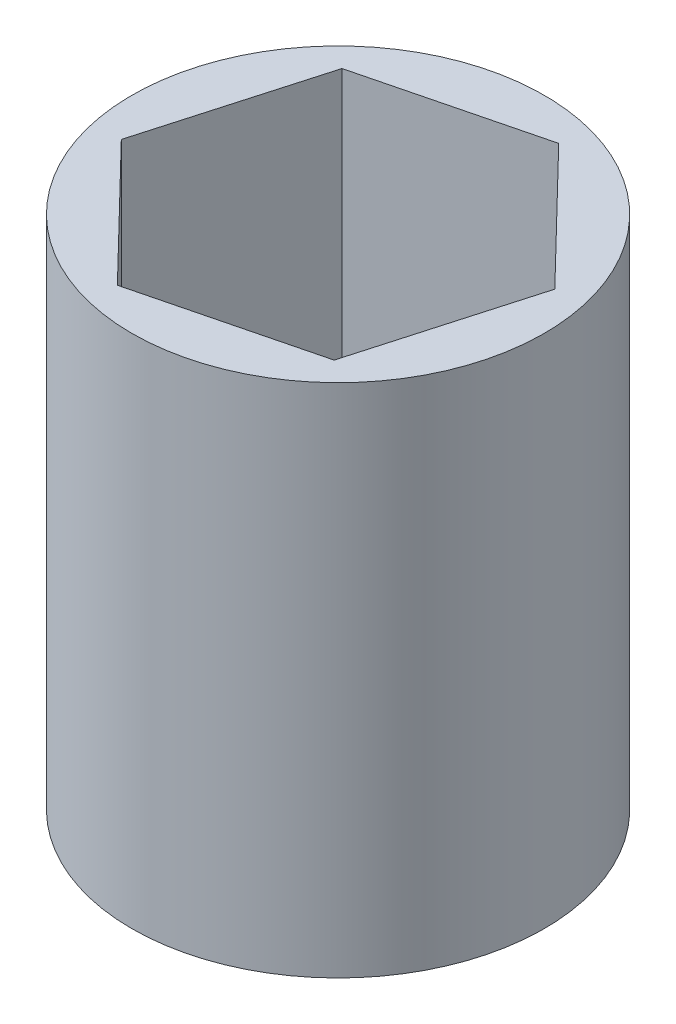
ISO-10303-21;
HEADER;
FILE_DESCRIPTION(('STEP AP214'),'2;1');
FILE_NAME('part.step','',(''),(''),'','','');
FILE_SCHEMA(('AUTOMOTIVE_DESIGN { 1 0 10303 214 1 1 1 1 }'));
ENDSEC;
DATA;
#1=APPLICATION_CONTEXT('core data for automotive mechanical design processes');
#2=APPLICATION_PROTOCOL_DEFINITION('international standard','automotive_design',2000,#1);
#3=PRODUCT_CONTEXT('',#1,'mechanical');
#4=PRODUCT('Part','Part','',(#3));
#5=PRODUCT_RELATED_PRODUCT_CATEGORY('part','',(#4));
#6=PRODUCT_DEFINITION_FORMATION('','',#4);
#7=PRODUCT_DEFINITION_CONTEXT('part definition',#1,'design');
#8=PRODUCT_DEFINITION('design','',#6,#7);
#9=PRODUCT_DEFINITION_SHAPE('','',#8);
#10=(LENGTH_UNIT() NAMED_UNIT(*) SI_UNIT(.MILLI.,.METRE.));
#11=(NAMED_UNIT(*) PLANE_ANGLE_UNIT() SI_UNIT($,.RADIAN.));
#12=(NAMED_UNIT(*) SI_UNIT($,.STERADIAN.) SOLID_ANGLE_UNIT());
#13=UNCERTAINTY_MEASURE_WITH_UNIT(LENGTH_MEASURE(1.E-05),#10,'distance_accuracy_value','');
#14=(GEOMETRIC_REPRESENTATION_CONTEXT(3) GLOBAL_UNCERTAINTY_ASSIGNED_CONTEXT((#13)) GLOBAL_UNIT_ASSIGNED_CONTEXT((#10,
#11,#12)) REPRESENTATION_CONTEXT('',''));
#15=CARTESIAN_POINT('',(0.,0.,0.));
#16=DIRECTION('',(0.,0.,1.));
#17=DIRECTION('',(1.,0.,0.));
#18=AXIS2_PLACEMENT_3D('',#15,#16,#17);
#19=CARTESIAN_POINT('',(0.,15.875,0.));
#20=DIRECTION('',(0.,1.,0.));
#21=DIRECTION('',(0.,0.,1.));
#22=AXIS2_PLACEMENT_3D('',#19,#20,#21);
#23=PLANE('',#22);
#24=CARTESIAN_POINT('',(0.,15.875,0.));
#25=DIRECTION('',(0.,1.,0.));
#26=DIRECTION('',(0.,0.,1.));
#27=AXIS2_PLACEMENT_3D('',#24,#25,#26);
#28=CIRCLE('',#27,6.35);
#29=CARTESIAN_POINT('',(0.,15.875,6.35));
#30=VERTEX_POINT('',#29);
#31=EDGE_CURVE('E11',#30,#30,#28,.T.);
#32=ORIENTED_EDGE('',*,*,#31,.T.);
#33=EDGE_LOOP('',(#32));
#34=FACE_BOUND('',#33,.T.);
#35=DIRECTION('',(-0.969830096251339,0.,0.243781837726107));
#36=VECTOR('',#35,1.);
#37=CARTESIAN_POINT('',(1.50566356257848,15.875,-5.28912584803231));
#38=LINE('',#37,#36);
#39=CARTESIAN_POINT('',(1.50566356257848,15.875,-5.28912584803231));
#40=VERTEX_POINT('',#39);
#41=CARTESIAN_POINT('',(-3.82768556691965,15.875,-3.9485058187617));
#42=VERTEX_POINT('',#41);
#43=EDGE_CURVE('E93',#40,#42,#38,.T.);
#44=ORIENTED_EDGE('',*,*,#43,.F.);
#45=DIRECTION('',(-0.696036312577735,0.,-0.718006581845313));
#46=VECTOR('',#45,1.);
#47=CARTESIAN_POINT('',(5.33334912949813,15.875,-1.34062002927061));
#48=LINE('',#47,#46);
#49=CARTESIAN_POINT('',(5.33334912949813,15.875,-1.34062002927061));
#50=VERTEX_POINT('',#49);
#51=EDGE_CURVE('E85',#50,#40,#48,.T.);
#52=ORIENTED_EDGE('',*,*,#51,.F.);
#53=DIRECTION('',(0.273793783673605,0.,-0.961788419571421));
#54=VECTOR('',#53,1.);
#55=CARTESIAN_POINT('',(3.82768556691965,15.875,3.9485058187617));
#56=LINE('',#55,#54);
#57=CARTESIAN_POINT('',(3.82768556691965,15.875,3.9485058187617));
#58=VERTEX_POINT('',#57);
#59=EDGE_CURVE('E113',#58,#50,#56,.T.);
#60=ORIENTED_EDGE('',*,*,#59,.F.);
#61=DIRECTION('',(0.969830096251339,0.,-0.243781837726108));
#62=VECTOR('',#61,1.);
#63=CARTESIAN_POINT('',(-1.50566356257847,15.875,5.28912584803231));
#64=LINE('',#63,#62);
#65=CARTESIAN_POINT('',(-1.50566356257847,15.875,5.28912584803231));
#66=VERTEX_POINT('',#65);
#67=EDGE_CURVE('E111',#66,#58,#64,.T.);
#68=ORIENTED_EDGE('',*,*,#67,.F.);
#69=DIRECTION('',(0.696036312577735,0.,0.718006581845313));
#70=VECTOR('',#69,1.);
#71=CARTESIAN_POINT('',(-5.33334912949813,15.875,1.34062002927061));
#72=LINE('',#71,#70);
#73=CARTESIAN_POINT('',(-5.33334912949813,15.875,1.34062002927061));
#74=VERTEX_POINT('',#73);
#75=EDGE_CURVE('E107',#74,#66,#72,.T.);
#76=ORIENTED_EDGE('',*,*,#75,.F.);
#77=DIRECTION('',(-0.273793783673604,0.,0.961788419571421));
#78=VECTOR('',#77,1.);
#79=CARTESIAN_POINT('',(-3.82768556691965,15.875,-3.9485058187617));
#80=LINE('',#79,#78);
#81=EDGE_CURVE('E105',#42,#74,#80,.T.);
#82=ORIENTED_EDGE('',*,*,#81,.F.);
#83=EDGE_LOOP('',(#44,#52,#60,#68,#76,#82));
#84=FACE_BOUND('',#83,.T.);
#85=ADVANCED_FACE('F32',(#34,#84),#23,.T.);
#86=CARTESIAN_POINT('',(0.,0.,0.));
#87=DIRECTION('',(0.,1.,0.));
#88=DIRECTION('',(0.,0.,1.));
#89=AXIS2_PLACEMENT_3D('',#86,#87,#88);
#90=PLANE('',#89);
#91=CARTESIAN_POINT('',(0.,0.,0.));
#92=DIRECTION('',(0.,1.,0.));
#93=DIRECTION('',(0.,0.,1.));
#94=AXIS2_PLACEMENT_3D('',#91,#92,#93);
#95=CIRCLE('',#94,6.35);
#96=CARTESIAN_POINT('',(0.,0.,6.35));
#97=VERTEX_POINT('',#96);
#98=EDGE_CURVE('E36',#97,#97,#95,.T.);
#99=ORIENTED_EDGE('',*,*,#98,.F.);
#100=EDGE_LOOP('',(#99));
#101=FACE_BOUND('',#100,.T.);
#102=DIRECTION('',(-0.696036312577735,0.,-0.718006581845313));
#103=VECTOR('',#102,1.);
#104=CARTESIAN_POINT('',(5.33334912949813,0.,-1.34062002927061));
#105=LINE('',#104,#103);
#106=CARTESIAN_POINT('',(5.33334912949813,0.,-1.34062002927061));
#107=VERTEX_POINT('',#106);
#108=CARTESIAN_POINT('',(1.50566356257848,0.,-5.28912584803231));
#109=VERTEX_POINT('',#108);
#110=EDGE_CURVE('E55',#107,#109,#105,.T.);
#111=ORIENTED_EDGE('',*,*,#110,.T.);
#112=DIRECTION('',(-0.969830096251339,0.,0.243781837726107));
#113=VECTOR('',#112,1.);
#114=CARTESIAN_POINT('',(1.50566356257848,0.,-5.28912584803231));
#115=LINE('',#114,#113);
#116=CARTESIAN_POINT('',(-3.82768556691965,0.,-3.9485058187617));
#117=VERTEX_POINT('',#116);
#118=EDGE_CURVE('E100',#109,#117,#115,.T.);
#119=ORIENTED_EDGE('',*,*,#118,.T.);
#120=DIRECTION('',(-0.273793783673604,0.,0.961788419571421));
#121=VECTOR('',#120,1.);
#122=CARTESIAN_POINT('',(-3.82768556691965,0.,-3.9485058187617));
#123=LINE('',#122,#121);
#124=CARTESIAN_POINT('',(-5.33334912949813,0.,1.34062002927061));
#125=VERTEX_POINT('',#124);
#126=EDGE_CURVE('E117',#117,#125,#123,.T.);
#127=ORIENTED_EDGE('',*,*,#126,.T.);
#128=DIRECTION('',(0.696036312577735,0.,0.718006581845313));
#129=VECTOR('',#128,1.);
#130=CARTESIAN_POINT('',(-5.33334912949813,0.,1.34062002927061));
#131=LINE('',#130,#129);
#132=CARTESIAN_POINT('',(-1.50566356257847,0.,5.28912584803231));
#133=VERTEX_POINT('',#132);
#134=EDGE_CURVE('E120',#125,#133,#131,.T.);
#135=ORIENTED_EDGE('',*,*,#134,.T.);
#136=DIRECTION('',(0.969830096251339,0.,-0.243781837726108));
#137=VECTOR('',#136,1.);
#138=CARTESIAN_POINT('',(-1.50566356257847,0.,5.28912584803231));
#139=LINE('',#138,#137);
#140=CARTESIAN_POINT('',(3.82768556691965,0.,3.9485058187617));
#141=VERTEX_POINT('',#140);
#142=EDGE_CURVE('E123',#133,#141,#139,.T.);
#143=ORIENTED_EDGE('',*,*,#142,.T.);
#144=DIRECTION('',(0.273793783673605,0.,-0.961788419571421));
#145=VECTOR('',#144,1.);
#146=CARTESIAN_POINT('',(3.82768556691965,0.,3.9485058187617));
#147=LINE('',#146,#145);
#148=EDGE_CURVE('E94',#141,#107,#147,.T.);
#149=ORIENTED_EDGE('',*,*,#148,.T.);
#150=EDGE_LOOP('',(#111,#119,#127,#135,#143,#149));
#151=FACE_BOUND('',#150,.T.);
#152=ADVANCED_FACE('F140',(#101,#151),#90,.F.);
#153=CARTESIAN_POINT('',(0.,15.875,0.));
#154=DIRECTION('',(0.,-1.,0.));
#155=DIRECTION('',(0.,0.,-1.));
#156=AXIS2_PLACEMENT_3D('',#153,#154,#155);
#157=CYLINDRICAL_SURFACE('',#156,6.35);
#158=ORIENTED_EDGE('',*,*,#31,.F.);
#159=EDGE_LOOP('',(#158));
#160=FACE_BOUND('',#159,.T.);
#161=ORIENTED_EDGE('',*,*,#98,.T.);
#162=EDGE_LOOP('',(#161));
#163=FACE_BOUND('',#162,.T.);
#164=ADVANCED_FACE('F34',(#160,#163),#157,.T.);
#165=CARTESIAN_POINT('',(5.33334912949813,15.875,-1.34062002927061));
#166=DIRECTION('',(-0.718006581845313,0.,0.696036312577735));
#167=DIRECTION('',(0.696036312577735,0.,0.718006581845313));
#168=AXIS2_PLACEMENT_3D('',#165,#166,#167);
#169=PLANE('',#168);
#170=ORIENTED_EDGE('',*,*,#110,.F.);
#171=DIRECTION('',(0.,-1.,0.));
#172=VECTOR('',#171,1.);
#173=CARTESIAN_POINT('',(5.33334912949813,15.875,-1.34062002927061));
#174=LINE('',#173,#172);
#175=EDGE_CURVE('E89',#50,#107,#174,.T.);
#176=ORIENTED_EDGE('',*,*,#175,.F.);
#177=ORIENTED_EDGE('',*,*,#51,.T.);
#178=DIRECTION('',(0.,-1.,0.));
#179=VECTOR('',#178,1.);
#180=CARTESIAN_POINT('',(1.50566356257848,15.875,-5.28912584803231));
#181=LINE('',#180,#179);
#182=EDGE_CURVE('E88',#40,#109,#181,.T.);
#183=ORIENTED_EDGE('',*,*,#182,.T.);
#184=EDGE_LOOP('',(#170,#176,#177,#183));
#185=FACE_BOUND('',#184,.T.);
#186=ADVANCED_FACE('F87',(#185),#169,.T.);
#187=CARTESIAN_POINT('',(1.50566356257848,15.875,-5.28912584803231));
#188=DIRECTION('',(0.243781837726107,0.,0.969830096251339));
#189=DIRECTION('',(0.969830096251339,0.,-0.243781837726107));
#190=AXIS2_PLACEMENT_3D('',#187,#188,#189);
#191=PLANE('',#190);
#192=ORIENTED_EDGE('',*,*,#118,.F.);
#193=ORIENTED_EDGE('',*,*,#182,.F.);
#194=ORIENTED_EDGE('',*,*,#43,.T.);
#195=DIRECTION('',(0.,-1.,0.));
#196=VECTOR('',#195,1.);
#197=CARTESIAN_POINT('',(-3.82768556691965,15.875,-3.9485058187617));
#198=LINE('',#197,#196);
#199=EDGE_CURVE('E101',#42,#117,#198,.T.);
#200=ORIENTED_EDGE('',*,*,#199,.T.);
#201=EDGE_LOOP('',(#192,#193,#194,#200));
#202=FACE_BOUND('',#201,.T.);
#203=ADVANCED_FACE('F97',(#202),#191,.T.);
#204=CARTESIAN_POINT('',(-3.82768556691965,15.875,-3.9485058187617));
#205=DIRECTION('',(0.961788419571421,0.,0.273793783673604));
#206=DIRECTION('',(0.273793783673604,0.,-0.961788419571421));
#207=AXIS2_PLACEMENT_3D('',#204,#205,#206);
#208=PLANE('',#207);
#209=ORIENTED_EDGE('',*,*,#126,.F.);
#210=ORIENTED_EDGE('',*,*,#199,.F.);
#211=ORIENTED_EDGE('',*,*,#81,.T.);
#212=DIRECTION('',(0.,-1.,0.));
#213=VECTOR('',#212,1.);
#214=CARTESIAN_POINT('',(-5.33334912949813,15.875,1.34062002927061));
#215=LINE('',#214,#213);
#216=EDGE_CURVE('E132',#74,#125,#215,.T.);
#217=ORIENTED_EDGE('',*,*,#216,.T.);
#218=EDGE_LOOP('',(#209,#210,#211,#217));
#219=FACE_BOUND('',#218,.T.);
#220=ADVANCED_FACE('F136',(#219),#208,.T.);
#221=CARTESIAN_POINT('',(-5.33334912949813,15.875,1.34062002927061));
#222=DIRECTION('',(0.718006581845313,0.,-0.696036312577735));
#223=DIRECTION('',(-0.696036312577735,0.,-0.718006581845313));
#224=AXIS2_PLACEMENT_3D('',#221,#222,#223);
#225=PLANE('',#224);
#226=ORIENTED_EDGE('',*,*,#134,.F.);
#227=ORIENTED_EDGE('',*,*,#216,.F.);
#228=ORIENTED_EDGE('',*,*,#75,.T.);
#229=DIRECTION('',(0.,-1.,0.));
#230=VECTOR('',#229,1.);
#231=CARTESIAN_POINT('',(-1.50566356257847,15.875,5.28912584803231));
#232=LINE('',#231,#230);
#233=EDGE_CURVE('E130',#66,#133,#232,.T.);
#234=ORIENTED_EDGE('',*,*,#233,.T.);
#235=EDGE_LOOP('',(#226,#227,#228,#234));
#236=FACE_BOUND('',#235,.T.);
#237=ADVANCED_FACE('F148',(#236),#225,.T.);
#238=CARTESIAN_POINT('',(-1.50566356257847,15.875,5.28912584803231));
#239=DIRECTION('',(-0.243781837726108,0.,-0.969830096251339));
#240=DIRECTION('',(-0.969830096251339,0.,0.243781837726108));
#241=AXIS2_PLACEMENT_3D('',#238,#239,#240);
#242=PLANE('',#241);
#243=ORIENTED_EDGE('',*,*,#142,.F.);
#244=ORIENTED_EDGE('',*,*,#233,.F.);
#245=ORIENTED_EDGE('',*,*,#67,.T.);
#246=DIRECTION('',(0.,-1.,0.));
#247=VECTOR('',#246,1.);
#248=CARTESIAN_POINT('',(3.82768556691965,15.875,3.9485058187617));
#249=LINE('',#248,#247);
#250=EDGE_CURVE('E47',#58,#141,#249,.T.);
#251=ORIENTED_EDGE('',*,*,#250,.T.);
#252=EDGE_LOOP('',(#243,#244,#245,#251));
#253=FACE_BOUND('',#252,.T.);
#254=ADVANCED_FACE('F146',(#253),#242,.T.);
#255=CARTESIAN_POINT('',(3.82768556691965,15.875,3.9485058187617));
#256=DIRECTION('',(-0.961788419571421,0.,-0.273793783673605));
#257=DIRECTION('',(-0.273793783673605,0.,0.961788419571421));
#258=AXIS2_PLACEMENT_3D('',#255,#256,#257);
#259=PLANE('',#258);
#260=ORIENTED_EDGE('',*,*,#148,.F.);
#261=ORIENTED_EDGE('',*,*,#250,.F.);
#262=ORIENTED_EDGE('',*,*,#59,.T.);
#263=ORIENTED_EDGE('',*,*,#175,.T.);
#264=EDGE_LOOP('',(#260,#261,#262,#263));
#265=FACE_BOUND('',#264,.T.);
#266=ADVANCED_FACE('F142',(#265),#259,.T.);
#267=CLOSED_SHELL('',(#85,#152,#164,#186,#203,#220,#237,#254,#266));
#268=MANIFOLD_SOLID_BREP('B2',#267);
#269=ADVANCED_BREP_SHAPE_REPRESENTATION('',(#18,#268),#14);
#270=SHAPE_DEFINITION_REPRESENTATION(#9,#269);
ENDSEC;
END-ISO-10303-21;
